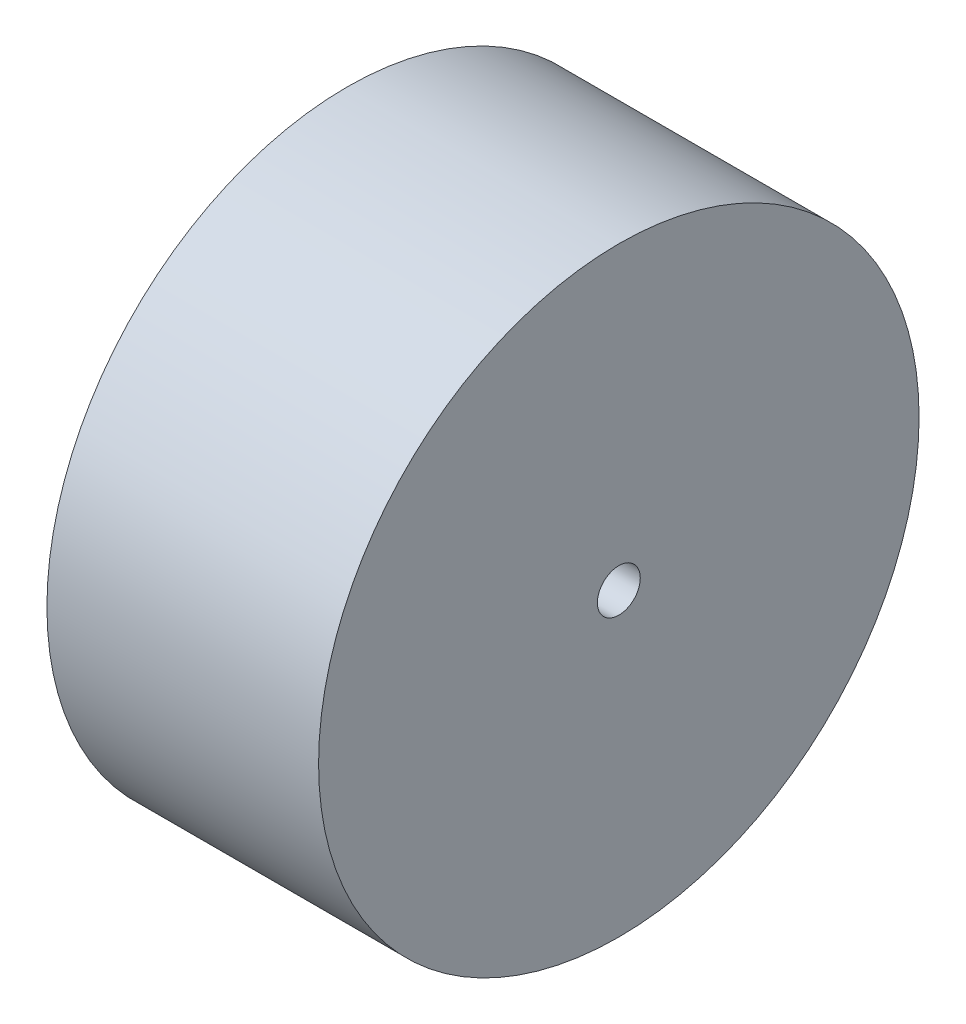
ISO-10303-21;
HEADER;
FILE_DESCRIPTION(('STEP AP214'),'2;1');
FILE_NAME('part.step','',(''),(''),'','','');
FILE_SCHEMA(('AUTOMOTIVE_DESIGN { 1 0 10303 214 1 1 1 1 }'));
ENDSEC;
DATA;
#1=APPLICATION_CONTEXT('core data for automotive mechanical design processes');
#2=APPLICATION_PROTOCOL_DEFINITION('international standard','automotive_design',2000,#1);
#3=PRODUCT_CONTEXT('',#1,'mechanical');
#4=PRODUCT('Part','Part','',(#3));
#5=PRODUCT_RELATED_PRODUCT_CATEGORY('part','',(#4));
#6=PRODUCT_DEFINITION_FORMATION('','',#4);
#7=PRODUCT_DEFINITION_CONTEXT('part definition',#1,'design');
#8=PRODUCT_DEFINITION('design','',#6,#7);
#9=PRODUCT_DEFINITION_SHAPE('','',#8);
#10=(LENGTH_UNIT() NAMED_UNIT(*) SI_UNIT(.MILLI.,.METRE.));
#11=(NAMED_UNIT(*) PLANE_ANGLE_UNIT() SI_UNIT($,.RADIAN.));
#12=(NAMED_UNIT(*) SI_UNIT($,.STERADIAN.) SOLID_ANGLE_UNIT());
#13=UNCERTAINTY_MEASURE_WITH_UNIT(LENGTH_MEASURE(1.E-05),#10,'distance_accuracy_value','');
#14=(GEOMETRIC_REPRESENTATION_CONTEXT(3) GLOBAL_UNCERTAINTY_ASSIGNED_CONTEXT((#13)) GLOBAL_UNIT_ASSIGNED_CONTEXT((#10,
#11,#12)) REPRESENTATION_CONTEXT('',''));
#15=CARTESIAN_POINT('',(0.,0.,0.));
#16=DIRECTION('',(0.,0.,1.));
#17=DIRECTION('',(1.,0.,0.));
#18=AXIS2_PLACEMENT_3D('',#15,#16,#17);
#19=CARTESIAN_POINT('',(19.,0.,0.));
#20=DIRECTION('',(-1.,0.,0.));
#21=DIRECTION('',(0.,0.,1.));
#22=AXIS2_PLACEMENT_3D('',#19,#20,#21);
#23=CYLINDRICAL_SURFACE('',#22,21.);
#24=CARTESIAN_POINT('',(19.,0.,0.));
#25=DIRECTION('',(1.,0.,0.));
#26=DIRECTION('',(0.,0.,-1.));
#27=AXIS2_PLACEMENT_3D('',#24,#25,#26);
#28=CIRCLE('',#27,21.);
#29=CARTESIAN_POINT('',(19.,0.,-21.));
#30=VERTEX_POINT('',#29);
#31=EDGE_CURVE('E10',#30,#30,#28,.T.);
#32=ORIENTED_EDGE('',*,*,#31,.F.);
#33=EDGE_LOOP('',(#32));
#34=FACE_BOUND('',#33,.T.);
#35=CARTESIAN_POINT('',(0.,0.,0.));
#36=DIRECTION('',(1.,0.,0.));
#37=DIRECTION('',(0.,0.,-1.));
#38=AXIS2_PLACEMENT_3D('',#35,#36,#37);
#39=CIRCLE('',#38,21.);
#40=CARTESIAN_POINT('',(0.,0.,-21.));
#41=VERTEX_POINT('',#40);
#42=EDGE_CURVE('E37',#41,#41,#39,.T.);
#43=ORIENTED_EDGE('',*,*,#42,.T.);
#44=EDGE_LOOP('',(#43));
#45=FACE_BOUND('',#44,.T.);
#46=ADVANCED_FACE('F40',(#34,#45),#23,.T.);
#47=CARTESIAN_POINT('',(19.,0.,0.));
#48=DIRECTION('',(1.,0.,0.));
#49=DIRECTION('',(0.,0.,-1.));
#50=AXIS2_PLACEMENT_3D('',#47,#48,#49);
#51=PLANE('',#50);
#52=CARTESIAN_POINT('',(19.,0.,0.));
#53=DIRECTION('',(1.,0.,0.));
#54=DIRECTION('',(0.,0.,-1.));
#55=AXIS2_PLACEMENT_3D('',#52,#53,#54);
#56=CIRCLE('',#55,1.5);
#57=CARTESIAN_POINT('',(19.,0.,-1.5));
#58=VERTEX_POINT('',#57);
#59=EDGE_CURVE('E47',#58,#58,#56,.T.);
#60=ORIENTED_EDGE('',*,*,#59,.F.);
#61=EDGE_LOOP('',(#60));
#62=FACE_BOUND('',#61,.T.);
#63=ORIENTED_EDGE('',*,*,#31,.T.);
#64=EDGE_LOOP('',(#63));
#65=FACE_BOUND('',#64,.T.);
#66=ADVANCED_FACE('F61',(#62,#65),#51,.T.);
#67=CARTESIAN_POINT('',(0.,0.,0.));
#68=DIRECTION('',(1.,0.,0.));
#69=DIRECTION('',(0.,0.,-1.));
#70=AXIS2_PLACEMENT_3D('',#67,#68,#69);
#71=PLANE('',#70);
#72=CARTESIAN_POINT('',(0.,0.,0.));
#73=DIRECTION('',(1.,0.,0.));
#74=DIRECTION('',(0.,0.,-1.));
#75=AXIS2_PLACEMENT_3D('',#72,#73,#74);
#76=CIRCLE('',#75,1.5);
#77=CARTESIAN_POINT('',(0.,0.,-1.5));
#78=VERTEX_POINT('',#77);
#79=EDGE_CURVE('E50',#78,#78,#76,.T.);
#80=ORIENTED_EDGE('',*,*,#79,.T.);
#81=EDGE_LOOP('',(#80));
#82=FACE_BOUND('',#81,.T.);
#83=ORIENTED_EDGE('',*,*,#42,.F.);
#84=EDGE_LOOP('',(#83));
#85=FACE_BOUND('',#84,.T.);
#86=ADVANCED_FACE('F54',(#82,#85),#71,.F.);
#87=CARTESIAN_POINT('',(0.,0.,0.));
#88=DIRECTION('',(1.,0.,0.));
#89=DIRECTION('',(0.,0.,-1.));
#90=AXIS2_PLACEMENT_3D('',#87,#88,#89);
#91=CYLINDRICAL_SURFACE('',#90,1.5);
#92=ORIENTED_EDGE('',*,*,#79,.F.);
#93=EDGE_LOOP('',(#92));
#94=FACE_BOUND('',#93,.T.);
#95=ORIENTED_EDGE('',*,*,#59,.T.);
#96=EDGE_LOOP('',(#95));
#97=FACE_BOUND('',#96,.T.);
#98=ADVANCED_FACE('F59',(#94,#97),#91,.F.);
#99=CLOSED_SHELL('',(#46,#66,#86,#98));
#100=MANIFOLD_SOLID_BREP('B2',#99);
#101=ADVANCED_BREP_SHAPE_REPRESENTATION('',(#18,#100),#14);
#102=SHAPE_DEFINITION_REPRESENTATION(#9,#101);
ENDSEC;
END-ISO-10303-21;
